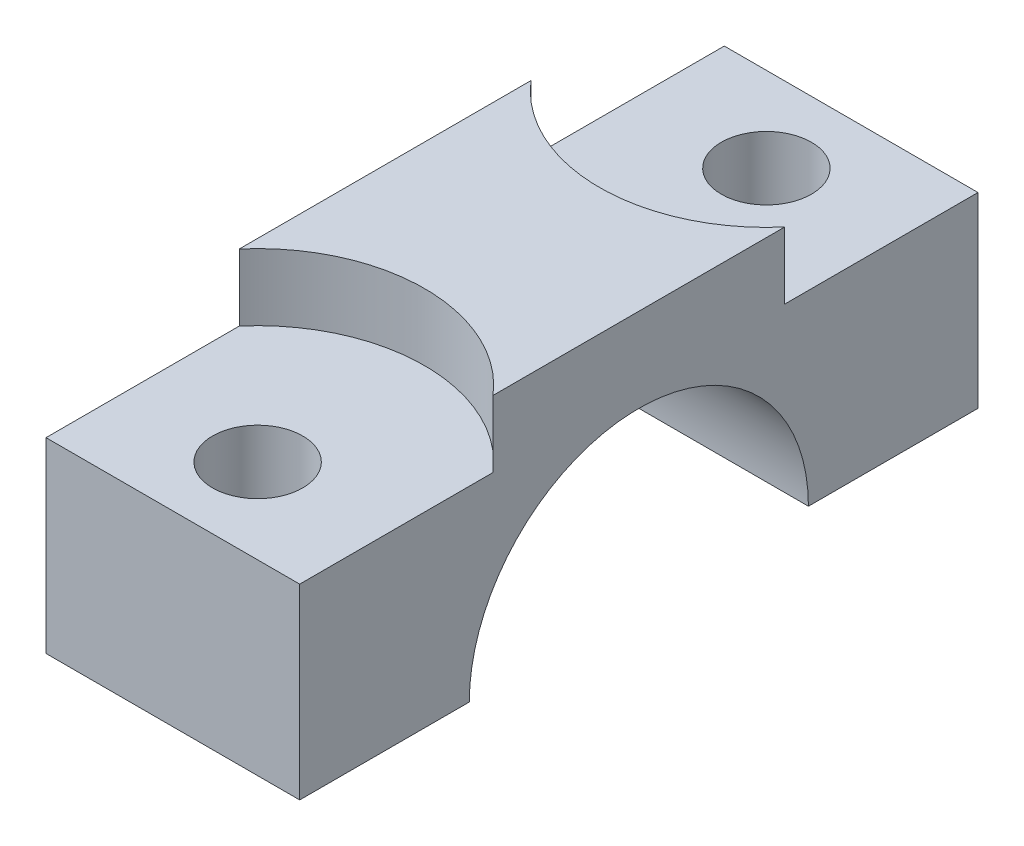
ISO-10303-21;
HEADER;
FILE_DESCRIPTION(('STEP AP214'),'2;1');
FILE_NAME('part.step','',(''),(''),'','','');
FILE_SCHEMA(('AUTOMOTIVE_DESIGN { 1 0 10303 214 1 1 1 1 }'));
ENDSEC;
DATA;
#1=APPLICATION_CONTEXT('core data for automotive mechanical design processes');
#2=APPLICATION_PROTOCOL_DEFINITION('international standard','automotive_design',2000,#1);
#3=PRODUCT_CONTEXT('',#1,'mechanical');
#4=PRODUCT('Part','Part','',(#3));
#5=PRODUCT_RELATED_PRODUCT_CATEGORY('part','',(#4));
#6=PRODUCT_DEFINITION_FORMATION('','',#4);
#7=PRODUCT_DEFINITION_CONTEXT('part definition',#1,'design');
#8=PRODUCT_DEFINITION('design','',#6,#7);
#9=PRODUCT_DEFINITION_SHAPE('','',#8);
#10=(LENGTH_UNIT() NAMED_UNIT(*) SI_UNIT(.MILLI.,.METRE.));
#11=(NAMED_UNIT(*) PLANE_ANGLE_UNIT() SI_UNIT($,.RADIAN.));
#12=(NAMED_UNIT(*) SI_UNIT($,.STERADIAN.) SOLID_ANGLE_UNIT());
#13=UNCERTAINTY_MEASURE_WITH_UNIT(LENGTH_MEASURE(1.E-05),#10,'distance_accuracy_value','');
#14=(GEOMETRIC_REPRESENTATION_CONTEXT(3) GLOBAL_UNCERTAINTY_ASSIGNED_CONTEXT((#13)) GLOBAL_UNIT_ASSIGNED_CONTEXT((#10,
#11,#12)) REPRESENTATION_CONTEXT('',''));
#15=CARTESIAN_POINT('',(0.,0.,0.));
#16=DIRECTION('',(0.,0.,1.));
#17=DIRECTION('',(1.,0.,0.));
#18=AXIS2_PLACEMENT_3D('',#15,#16,#17);
#19=CARTESIAN_POINT('',(9.5,19.,25.4));
#20=DIRECTION('',(0.,-1.,0.));
#21=DIRECTION('',(0.,0.,-1.));
#22=AXIS2_PLACEMENT_3D('',#19,#20,#21);
#23=PLANE('',#22);
#24=CARTESIAN_POINT('',(0.,19.,-19.05));
#25=DIRECTION('',(0.,1.,0.));
#26=DIRECTION('',(0.,0.,1.));
#27=AXIS2_PLACEMENT_3D('',#24,#25,#26);
#28=CIRCLE('',#27,12.5);
#29=CARTESIAN_POINT('',(-9.5,19.,-10.925961595364));
#30=VERTEX_POINT('',#29);
#31=CARTESIAN_POINT('',(9.5,19.,-10.925961595364));
#32=VERTEX_POINT('',#31);
#33=EDGE_CURVE('E56',#30,#32,#28,.T.);
#34=ORIENTED_EDGE('',*,*,#33,.F.);
#35=DIRECTION('',(0.,0.,1.));
#36=VECTOR('',#35,1.);
#37=CARTESIAN_POINT('',(-9.5,19.,25.4));
#38=LINE('',#37,#36);
#39=CARTESIAN_POINT('',(-9.5,19.,10.925961595364));
#40=VERTEX_POINT('',#39);
#41=EDGE_CURVE('E131',#30,#40,#38,.T.);
#42=ORIENTED_EDGE('',*,*,#41,.T.);
#43=CARTESIAN_POINT('',(0.,19.,19.05));
#44=DIRECTION('',(0.,1.,0.));
#45=DIRECTION('',(0.,0.,1.));
#46=AXIS2_PLACEMENT_3D('',#43,#44,#45);
#47=CIRCLE('',#46,12.5);
#48=CARTESIAN_POINT('',(9.5,19.,10.925961595364));
#49=VERTEX_POINT('',#48);
#50=EDGE_CURVE('E227',#49,#40,#47,.T.);
#51=ORIENTED_EDGE('',*,*,#50,.F.);
#52=DIRECTION('',(0.,0.,1.));
#53=VECTOR('',#52,1.);
#54=CARTESIAN_POINT('',(9.5,19.,25.4));
#55=LINE('',#54,#53);
#56=EDGE_CURVE('E133',#32,#49,#55,.T.);
#57=ORIENTED_EDGE('',*,*,#56,.F.);
#58=EDGE_LOOP('',(#34,#42,#51,#57));
#59=FACE_BOUND('',#58,.T.);
#60=ADVANCED_FACE('F39',(#59),#23,.F.);
#61=CARTESIAN_POINT('',(9.5,19.,25.4));
#62=DIRECTION('',(0.,0.,-1.));
#63=DIRECTION('',(0.,1.,0.));
#64=AXIS2_PLACEMENT_3D('',#61,#62,#63);
#65=PLANE('',#64);
#66=DIRECTION('',(0.,-1.,0.));
#67=VECTOR('',#66,1.);
#68=CARTESIAN_POINT('',(9.5,19.,25.4));
#69=LINE('',#68,#67);
#70=CARTESIAN_POINT('',(9.5,14.,25.4));
#71=VERTEX_POINT('',#70);
#72=CARTESIAN_POINT('',(9.5,0.,25.4));
#73=VERTEX_POINT('',#72);
#74=EDGE_CURVE('E141',#71,#73,#69,.T.);
#75=ORIENTED_EDGE('',*,*,#74,.F.);
#76=DIRECTION('',(-1.,0.,0.));
#77=VECTOR('',#76,1.);
#78=CARTESIAN_POINT('',(9.5,14.,25.4));
#79=LINE('',#78,#77);
#80=CARTESIAN_POINT('',(-9.5,14.,25.4));
#81=VERTEX_POINT('',#80);
#82=EDGE_CURVE('E240',#71,#81,#79,.T.);
#83=ORIENTED_EDGE('',*,*,#82,.T.);
#84=DIRECTION('',(0.,-1.,0.));
#85=VECTOR('',#84,1.);
#86=CARTESIAN_POINT('',(-9.5,19.,25.4));
#87=LINE('',#86,#85);
#88=CARTESIAN_POINT('',(-9.5,0.,25.4));
#89=VERTEX_POINT('',#88);
#90=EDGE_CURVE('E179',#81,#89,#87,.T.);
#91=ORIENTED_EDGE('',*,*,#90,.T.);
#92=DIRECTION('',(-1.,0.,0.));
#93=VECTOR('',#92,1.);
#94=CARTESIAN_POINT('',(9.5,0.,25.4));
#95=LINE('',#94,#93);
#96=EDGE_CURVE('E165',#73,#89,#95,.T.);
#97=ORIENTED_EDGE('',*,*,#96,.F.);
#98=EDGE_LOOP('',(#75,#83,#91,#97));
#99=FACE_BOUND('',#98,.T.);
#100=ADVANCED_FACE('F41',(#99),#65,.F.);
#101=CARTESIAN_POINT('',(9.5,0.,25.4));
#102=DIRECTION('',(0.,1.,0.));
#103=DIRECTION('',(0.,0.,1.));
#104=AXIS2_PLACEMENT_3D('',#101,#102,#103);
#105=PLANE('',#104);
#106=CARTESIAN_POINT('',(0.,0.,19.05));
#107=DIRECTION('',(0.,1.,0.));
#108=DIRECTION('',(0.,0.,1.));
#109=AXIS2_PLACEMENT_3D('',#106,#107,#108);
#110=CIRCLE('',#109,3.37499999999994);
#111=CARTESIAN_POINT('',(0.,0.,22.4249999999999));
#112=VERTEX_POINT('',#111);
#113=EDGE_CURVE('E175',#112,#112,#110,.T.);
#114=ORIENTED_EDGE('',*,*,#113,.T.);
#115=EDGE_LOOP('',(#114));
#116=FACE_BOUND('',#115,.T.);
#117=DIRECTION('',(0.,0.,-1.));
#118=VECTOR('',#117,1.);
#119=CARTESIAN_POINT('',(-9.5,0.,25.4));
#120=LINE('',#119,#118);
#121=CARTESIAN_POINT('',(-9.5,0.,12.7));
#122=VERTEX_POINT('',#121);
#123=EDGE_CURVE('E209',#89,#122,#120,.T.);
#124=ORIENTED_EDGE('',*,*,#123,.T.);
#125=DIRECTION('',(-1.,0.,0.));
#126=VECTOR('',#125,1.);
#127=CARTESIAN_POINT('',(9.5,0.,12.7));
#128=LINE('',#127,#126);
#129=CARTESIAN_POINT('',(9.5,0.,12.7));
#130=VERTEX_POINT('',#129);
#131=EDGE_CURVE('E161',#130,#122,#128,.T.);
#132=ORIENTED_EDGE('',*,*,#131,.F.);
#133=DIRECTION('',(0.,0.,-1.));
#134=VECTOR('',#133,1.);
#135=CARTESIAN_POINT('',(9.5,0.,25.4));
#136=LINE('',#135,#134);
#137=EDGE_CURVE('E146',#73,#130,#136,.T.);
#138=ORIENTED_EDGE('',*,*,#137,.F.);
#139=ORIENTED_EDGE('',*,*,#96,.T.);
#140=EDGE_LOOP('',(#124,#132,#138,#139));
#141=FACE_BOUND('',#140,.T.);
#142=ADVANCED_FACE('F257',(#116,#141),#105,.F.);
#143=CARTESIAN_POINT('',(9.5,0.,0.));
#144=DIRECTION('',(-1.,0.,0.));
#145=DIRECTION('',(0.,0.,1.));
#146=AXIS2_PLACEMENT_3D('',#143,#144,#145);
#147=CYLINDRICAL_SURFACE('',#146,12.7);
#148=CARTESIAN_POINT('',(-9.5,0.,0.));
#149=DIRECTION('',(-1.,0.,0.));
#150=DIRECTION('',(0.,0.,-1.));
#151=AXIS2_PLACEMENT_3D('',#148,#149,#150);
#152=CIRCLE('',#151,12.7);
#153=CARTESIAN_POINT('',(-9.5,0.,-12.7));
#154=VERTEX_POINT('',#153);
#155=EDGE_CURVE('E212',#122,#154,#152,.T.);
#156=ORIENTED_EDGE('',*,*,#155,.T.);
#157=DIRECTION('',(-1.,0.,0.));
#158=VECTOR('',#157,1.);
#159=CARTESIAN_POINT('',(9.5,0.,-12.7));
#160=LINE('',#159,#158);
#161=CARTESIAN_POINT('',(9.5,0.,-12.7));
#162=VERTEX_POINT('',#161);
#163=EDGE_CURVE('E157',#162,#154,#160,.T.);
#164=ORIENTED_EDGE('',*,*,#163,.F.);
#165=CARTESIAN_POINT('',(9.5,0.,0.));
#166=DIRECTION('',(-1.,0.,0.));
#167=DIRECTION('',(0.,0.,-1.));
#168=AXIS2_PLACEMENT_3D('',#165,#166,#167);
#169=CIRCLE('',#168,12.7);
#170=EDGE_CURVE('E203',#130,#162,#169,.T.);
#171=ORIENTED_EDGE('',*,*,#170,.F.);
#172=ORIENTED_EDGE('',*,*,#131,.T.);
#173=EDGE_LOOP('',(#156,#164,#171,#172));
#174=FACE_BOUND('',#173,.T.);
#175=ADVANCED_FACE('F252',(#174),#147,.F.);
#176=CARTESIAN_POINT('',(9.5,0.,-12.7));
#177=DIRECTION('',(0.,1.,0.));
#178=DIRECTION('',(0.,0.,1.));
#179=AXIS2_PLACEMENT_3D('',#176,#177,#178);
#180=PLANE('',#179);
#181=CARTESIAN_POINT('',(0.,0.,-19.05));
#182=DIRECTION('',(0.,1.,0.));
#183=DIRECTION('',(0.,0.,1.));
#184=AXIS2_PLACEMENT_3D('',#181,#182,#183);
#185=CIRCLE('',#184,3.37499999999994);
#186=CARTESIAN_POINT('',(0.,0.,-15.6750000000001));
#187=VERTEX_POINT('',#186);
#188=EDGE_CURVE('E43',#187,#187,#185,.T.);
#189=ORIENTED_EDGE('',*,*,#188,.T.);
#190=EDGE_LOOP('',(#189));
#191=FACE_BOUND('',#190,.T.);
#192=DIRECTION('',(0.,0.,-1.));
#193=VECTOR('',#192,1.);
#194=CARTESIAN_POINT('',(-9.5,0.,-12.7));
#195=LINE('',#194,#193);
#196=CARTESIAN_POINT('',(-9.5,0.,-25.4));
#197=VERTEX_POINT('',#196);
#198=EDGE_CURVE('E149',#154,#197,#195,.T.);
#199=ORIENTED_EDGE('',*,*,#198,.T.);
#200=DIRECTION('',(-1.,0.,0.));
#201=VECTOR('',#200,1.);
#202=CARTESIAN_POINT('',(9.5,0.,-25.4));
#203=LINE('',#202,#201);
#204=CARTESIAN_POINT('',(9.5,0.,-25.4));
#205=VERTEX_POINT('',#204);
#206=EDGE_CURVE('E153',#205,#197,#203,.T.);
#207=ORIENTED_EDGE('',*,*,#206,.F.);
#208=DIRECTION('',(0.,0.,-1.));
#209=VECTOR('',#208,1.);
#210=CARTESIAN_POINT('',(9.5,0.,-12.7));
#211=LINE('',#210,#209);
#212=EDGE_CURVE('E195',#162,#205,#211,.T.);
#213=ORIENTED_EDGE('',*,*,#212,.F.);
#214=ORIENTED_EDGE('',*,*,#163,.T.);
#215=EDGE_LOOP('',(#199,#207,#213,#214));
#216=FACE_BOUND('',#215,.T.);
#217=ADVANCED_FACE('F217',(#191,#216),#180,.F.);
#218=CARTESIAN_POINT('',(9.5,19.,-25.4));
#219=DIRECTION('',(0.,0.,1.));
#220=DIRECTION('',(0.,-1.,0.));
#221=AXIS2_PLACEMENT_3D('',#218,#219,#220);
#222=PLANE('',#221);
#223=DIRECTION('',(0.,1.,0.));
#224=VECTOR('',#223,1.);
#225=CARTESIAN_POINT('',(-9.5,19.,-25.4));
#226=LINE('',#225,#224);
#227=CARTESIAN_POINT('',(-9.5,14.,-25.4));
#228=VERTEX_POINT('',#227);
#229=EDGE_CURVE('E142',#197,#228,#226,.T.);
#230=ORIENTED_EDGE('',*,*,#229,.T.);
#231=DIRECTION('',(1.,0.,0.));
#232=VECTOR('',#231,1.);
#233=CARTESIAN_POINT('',(9.5,14.,-25.4));
#234=LINE('',#233,#232);
#235=CARTESIAN_POINT('',(9.5,14.,-25.4));
#236=VERTEX_POINT('',#235);
#237=EDGE_CURVE('E125',#228,#236,#234,.T.);
#238=ORIENTED_EDGE('',*,*,#237,.T.);
#239=DIRECTION('',(0.,1.,0.));
#240=VECTOR('',#239,1.);
#241=CARTESIAN_POINT('',(9.5,19.,-25.4));
#242=LINE('',#241,#240);
#243=EDGE_CURVE('E193',#205,#236,#242,.T.);
#244=ORIENTED_EDGE('',*,*,#243,.F.);
#245=ORIENTED_EDGE('',*,*,#206,.T.);
#246=EDGE_LOOP('',(#230,#238,#244,#245));
#247=FACE_BOUND('',#246,.T.);
#248=ADVANCED_FACE('F221',(#247),#222,.F.);
#249=CARTESIAN_POINT('',(9.5,0.,0.));
#250=DIRECTION('',(1.,0.,0.));
#251=DIRECTION('',(0.,0.,-1.));
#252=AXIS2_PLACEMENT_3D('',#249,#250,#251);
#253=PLANE('',#252);
#254=DIRECTION('',(0.,0.,-1.));
#255=VECTOR('',#254,1.);
#256=CARTESIAN_POINT('',(9.5,14.,0.));
#257=LINE('',#256,#255);
#258=CARTESIAN_POINT('',(9.5,14.,-10.925961595364));
#259=VERTEX_POINT('',#258);
#260=EDGE_CURVE('E11',#259,#236,#257,.T.);
#261=ORIENTED_EDGE('',*,*,#260,.F.);
#262=DIRECTION('',(0.,1.,0.));
#263=VECTOR('',#262,1.);
#264=CARTESIAN_POINT('',(9.5,19.,-10.925961595364));
#265=LINE('',#264,#263);
#266=EDGE_CURVE('E49',#32,#259,#265,.F.);
#267=ORIENTED_EDGE('',*,*,#266,.F.);
#268=ORIENTED_EDGE('',*,*,#56,.T.);
#269=DIRECTION('',(0.,1.,0.));
#270=VECTOR('',#269,1.);
#271=CARTESIAN_POINT('',(9.5,19.,10.925961595364));
#272=LINE('',#271,#270);
#273=CARTESIAN_POINT('',(9.5,14.,10.925961595364));
#274=VERTEX_POINT('',#273);
#275=EDGE_CURVE('E169',#274,#49,#272,.T.);
#276=ORIENTED_EDGE('',*,*,#275,.F.);
#277=DIRECTION('',(0.,0.,-1.));
#278=VECTOR('',#277,1.);
#279=CARTESIAN_POINT('',(9.5,14.,0.));
#280=LINE('',#279,#278);
#281=EDGE_CURVE('E172',#71,#274,#280,.T.);
#282=ORIENTED_EDGE('',*,*,#281,.F.);
#283=ORIENTED_EDGE('',*,*,#74,.T.);
#284=ORIENTED_EDGE('',*,*,#137,.T.);
#285=ORIENTED_EDGE('',*,*,#170,.T.);
#286=ORIENTED_EDGE('',*,*,#212,.T.);
#287=ORIENTED_EDGE('',*,*,#243,.T.);
#288=EDGE_LOOP('',(#261,#267,#268,#276,#282,#283,#284,#285,#286,#287));
#289=FACE_BOUND('',#288,.T.);
#290=ADVANCED_FACE('F191',(#289),#253,.T.);
#291=CARTESIAN_POINT('',(-9.5,0.,0.));
#292=DIRECTION('',(1.,0.,0.));
#293=DIRECTION('',(0.,0.,-1.));
#294=AXIS2_PLACEMENT_3D('',#291,#292,#293);
#295=PLANE('',#294);
#296=DIRECTION('',(0.,1.,0.));
#297=VECTOR('',#296,1.);
#298=CARTESIAN_POINT('',(-9.5,19.,-10.925961595364));
#299=LINE('',#298,#297);
#300=CARTESIAN_POINT('',(-9.5,14.,-10.925961595364));
#301=VERTEX_POINT('',#300);
#302=EDGE_CURVE('E117',#30,#301,#299,.F.);
#303=ORIENTED_EDGE('',*,*,#302,.T.);
#304=DIRECTION('',(0.,0.,-1.));
#305=VECTOR('',#304,1.);
#306=CARTESIAN_POINT('',(-9.5,14.,0.));
#307=LINE('',#306,#305);
#308=EDGE_CURVE('E187',#301,#228,#307,.T.);
#309=ORIENTED_EDGE('',*,*,#308,.T.);
#310=ORIENTED_EDGE('',*,*,#229,.F.);
#311=ORIENTED_EDGE('',*,*,#198,.F.);
#312=ORIENTED_EDGE('',*,*,#155,.F.);
#313=ORIENTED_EDGE('',*,*,#123,.F.);
#314=ORIENTED_EDGE('',*,*,#90,.F.);
#315=DIRECTION('',(0.,0.,-1.));
#316=VECTOR('',#315,1.);
#317=CARTESIAN_POINT('',(-9.5,14.,0.));
#318=LINE('',#317,#316);
#319=CARTESIAN_POINT('',(-9.5,14.,10.925961595364));
#320=VERTEX_POINT('',#319);
#321=EDGE_CURVE('E180',#81,#320,#318,.T.);
#322=ORIENTED_EDGE('',*,*,#321,.T.);
#323=DIRECTION('',(0.,1.,0.));
#324=VECTOR('',#323,1.);
#325=CARTESIAN_POINT('',(-9.5,19.,10.925961595364));
#326=LINE('',#325,#324);
#327=EDGE_CURVE('E139',#320,#40,#326,.T.);
#328=ORIENTED_EDGE('',*,*,#327,.T.);
#329=ORIENTED_EDGE('',*,*,#41,.F.);
#330=EDGE_LOOP('',(#303,#309,#310,#311,#312,#313,#314,#322,#328,#329));
#331=FACE_BOUND('',#330,.T.);
#332=ADVANCED_FACE('F137',(#331),#295,.F.);
#333=CARTESIAN_POINT('',(0.,19.,19.05));
#334=DIRECTION('',(0.,1.,0.));
#335=DIRECTION('',(0.,0.,1.));
#336=AXIS2_PLACEMENT_3D('',#333,#334,#335);
#337=CYLINDRICAL_SURFACE('',#336,3.37499999999994);
#338=CARTESIAN_POINT('',(0.,14.,19.05));
#339=DIRECTION('',(0.,1.,0.));
#340=DIRECTION('',(0.,0.,1.));
#341=AXIS2_PLACEMENT_3D('',#338,#339,#340);
#342=CIRCLE('',#341,3.37499999999996);
#343=CARTESIAN_POINT('',(0.,14.,22.425));
#344=VERTEX_POINT('',#343);
#345=EDGE_CURVE('E234',#344,#344,#342,.T.);
#346=ORIENTED_EDGE('',*,*,#345,.T.);
#347=EDGE_LOOP('',(#346));
#348=FACE_BOUND('',#347,.T.);
#349=ORIENTED_EDGE('',*,*,#113,.F.);
#350=EDGE_LOOP('',(#349));
#351=FACE_BOUND('',#350,.T.);
#352=ADVANCED_FACE('F274',(#348,#351),#337,.F.);
#353=CARTESIAN_POINT('',(3.37499999999996,14.,19.05));
#354=DIRECTION('',(0.,-1.,0.));
#355=DIRECTION('',(0.,0.,-1.));
#356=AXIS2_PLACEMENT_3D('',#353,#354,#355);
#357=PLANE('',#356);
#358=ORIENTED_EDGE('',*,*,#345,.F.);
#359=EDGE_LOOP('',(#358));
#360=FACE_BOUND('',#359,.T.);
#361=ORIENTED_EDGE('',*,*,#82,.F.);
#362=ORIENTED_EDGE('',*,*,#281,.T.);
#363=CARTESIAN_POINT('',(0.,14.,19.05));
#364=DIRECTION('',(0.,1.,0.));
#365=DIRECTION('',(0.,0.,1.));
#366=AXIS2_PLACEMENT_3D('',#363,#364,#365);
#367=CIRCLE('',#366,12.5);
#368=EDGE_CURVE('E64',#274,#320,#367,.T.);
#369=ORIENTED_EDGE('',*,*,#368,.T.);
#370=ORIENTED_EDGE('',*,*,#321,.F.);
#371=EDGE_LOOP('',(#361,#362,#369,#370));
#372=FACE_BOUND('',#371,.T.);
#373=ADVANCED_FACE('F262',(#360,#372),#357,.F.);
#374=CARTESIAN_POINT('',(0.,19.,19.05));
#375=DIRECTION('',(0.,1.,0.));
#376=DIRECTION('',(0.,0.,1.));
#377=AXIS2_PLACEMENT_3D('',#374,#375,#376);
#378=CYLINDRICAL_SURFACE('',#377,12.5);
#379=ORIENTED_EDGE('',*,*,#368,.F.);
#380=ORIENTED_EDGE('',*,*,#275,.T.);
#381=ORIENTED_EDGE('',*,*,#50,.T.);
#382=ORIENTED_EDGE('',*,*,#327,.F.);
#383=EDGE_LOOP('',(#379,#380,#381,#382));
#384=FACE_BOUND('',#383,.T.);
#385=ADVANCED_FACE('F264',(#384),#378,.F.);
#386=CARTESIAN_POINT('',(0.,19.,-19.05));
#387=DIRECTION('',(0.,1.,0.));
#388=DIRECTION('',(0.,0.,1.));
#389=AXIS2_PLACEMENT_3D('',#386,#387,#388);
#390=CYLINDRICAL_SURFACE('',#389,3.37499999999994);
#391=CARTESIAN_POINT('',(0.,14.,-19.05));
#392=DIRECTION('',(0.,1.,0.));
#393=DIRECTION('',(0.,0.,1.));
#394=AXIS2_PLACEMENT_3D('',#391,#392,#393);
#395=CIRCLE('',#394,3.37499999999996);
#396=CARTESIAN_POINT('',(0.,14.,-15.675));
#397=VERTEX_POINT('',#396);
#398=EDGE_CURVE('E126',#397,#397,#395,.T.);
#399=ORIENTED_EDGE('',*,*,#398,.T.);
#400=EDGE_LOOP('',(#399));
#401=FACE_BOUND('',#400,.T.);
#402=ORIENTED_EDGE('',*,*,#188,.F.);
#403=EDGE_LOOP('',(#402));
#404=FACE_BOUND('',#403,.T.);
#405=ADVANCED_FACE('F266',(#401,#404),#390,.F.);
#406=CARTESIAN_POINT('',(3.37499999999996,14.,-19.05));
#407=DIRECTION('',(0.,-1.,0.));
#408=DIRECTION('',(0.,0.,-1.));
#409=AXIS2_PLACEMENT_3D('',#406,#407,#408);
#410=PLANE('',#409);
#411=ORIENTED_EDGE('',*,*,#398,.F.);
#412=EDGE_LOOP('',(#411));
#413=FACE_BOUND('',#412,.T.);
#414=CARTESIAN_POINT('',(0.,14.,-19.05));
#415=DIRECTION('',(0.,1.,0.));
#416=DIRECTION('',(0.,0.,1.));
#417=AXIS2_PLACEMENT_3D('',#414,#415,#416);
#418=CIRCLE('',#417,12.5);
#419=EDGE_CURVE('E120',#301,#259,#418,.T.);
#420=ORIENTED_EDGE('',*,*,#419,.T.);
#421=ORIENTED_EDGE('',*,*,#260,.T.);
#422=ORIENTED_EDGE('',*,*,#237,.F.);
#423=ORIENTED_EDGE('',*,*,#308,.F.);
#424=EDGE_LOOP('',(#420,#421,#422,#423));
#425=FACE_BOUND('',#424,.T.);
#426=ADVANCED_FACE('F185',(#413,#425),#410,.F.);
#427=CARTESIAN_POINT('',(0.,19.,-19.05));
#428=DIRECTION('',(0.,1.,0.));
#429=DIRECTION('',(0.,0.,1.));
#430=AXIS2_PLACEMENT_3D('',#427,#428,#429);
#431=CYLINDRICAL_SURFACE('',#430,12.5);
#432=ORIENTED_EDGE('',*,*,#33,.T.);
#433=ORIENTED_EDGE('',*,*,#266,.T.);
#434=ORIENTED_EDGE('',*,*,#419,.F.);
#435=ORIENTED_EDGE('',*,*,#302,.F.);
#436=EDGE_LOOP('',(#432,#433,#434,#435));
#437=FACE_BOUND('',#436,.T.);
#438=ADVANCED_FACE('F118',(#437),#431,.F.);
#439=CLOSED_SHELL('',(#60,#100,#142,#175,#217,#248,#290,#332,#352,#373,#385,#405,#426,#438));
#440=MANIFOLD_SOLID_BREP('B2',#439);
#441=ADVANCED_BREP_SHAPE_REPRESENTATION('',(#18,#440),#14);
#442=SHAPE_DEFINITION_REPRESENTATION(#9,#441);
ENDSEC;
END-ISO-10303-21;
